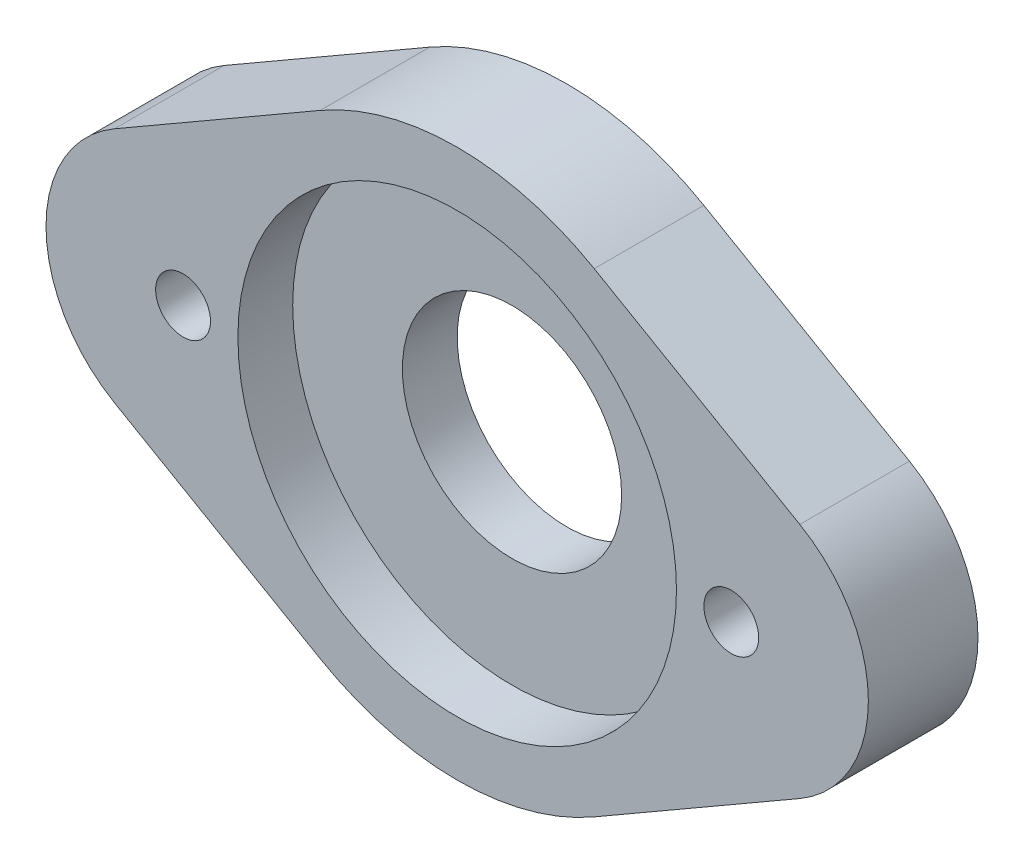
ISO-10303-21;
HEADER;
FILE_DESCRIPTION(('STEP AP214'),'2;1');
FILE_NAME('part.step','',(''),(''),'','','');
FILE_SCHEMA(('AUTOMOTIVE_DESIGN { 1 0 10303 214 1 1 1 1 }'));
ENDSEC;
DATA;
#1=APPLICATION_CONTEXT('core data for automotive mechanical design processes');
#2=APPLICATION_PROTOCOL_DEFINITION('international standard','automotive_design',2000,#1);
#3=PRODUCT_CONTEXT('',#1,'mechanical');
#4=PRODUCT('Part','Part','',(#3));
#5=PRODUCT_RELATED_PRODUCT_CATEGORY('part','',(#4));
#6=PRODUCT_DEFINITION_FORMATION('','',#4);
#7=PRODUCT_DEFINITION_CONTEXT('part definition',#1,'design');
#8=PRODUCT_DEFINITION('design','',#6,#7);
#9=PRODUCT_DEFINITION_SHAPE('','',#8);
#10=(LENGTH_UNIT() NAMED_UNIT(*) SI_UNIT(.MILLI.,.METRE.));
#11=(NAMED_UNIT(*) PLANE_ANGLE_UNIT() SI_UNIT($,.RADIAN.));
#12=(NAMED_UNIT(*) SI_UNIT($,.STERADIAN.) SOLID_ANGLE_UNIT());
#13=UNCERTAINTY_MEASURE_WITH_UNIT(LENGTH_MEASURE(1.E-05),#10,'distance_accuracy_value','');
#14=(GEOMETRIC_REPRESENTATION_CONTEXT(3) GLOBAL_UNCERTAINTY_ASSIGNED_CONTEXT((#13)) GLOBAL_UNIT_ASSIGNED_CONTEXT((#10,
#11,#12)) REPRESENTATION_CONTEXT('',''));
#15=CARTESIAN_POINT('',(0.,0.,0.));
#16=DIRECTION('',(0.,0.,1.));
#17=DIRECTION('',(1.,0.,0.));
#18=AXIS2_PLACEMENT_3D('',#15,#16,#17);
#19=CARTESIAN_POINT('',(0.,0.,10.));
#20=DIRECTION('',(0.,0.,-1.));
#21=DIRECTION('',(-1.,0.,0.));
#22=AXIS2_PLACEMENT_3D('',#19,#20,#21);
#23=CYLINDRICAL_SURFACE('',#22,25.);
#24=CARTESIAN_POINT('',(0.,0.,0.));
#25=DIRECTION('',(0.,0.,1.));
#26=DIRECTION('',(1.,0.,0.));
#27=AXIS2_PLACEMENT_3D('',#24,#25,#26);
#28=CIRCLE('',#27,25.);
#29=CARTESIAN_POINT('',(12.5,21.650635094611,0.));
#30=VERTEX_POINT('',#29);
#31=CARTESIAN_POINT('',(-12.5,21.650635094611,0.));
#32=VERTEX_POINT('',#31);
#33=EDGE_CURVE('E145',#30,#32,#28,.T.);
#34=ORIENTED_EDGE('',*,*,#33,.T.);
#35=DIRECTION('',(0.,0.,-1.));
#36=VECTOR('',#35,1.);
#37=CARTESIAN_POINT('',(-12.5,21.650635094611,10.));
#38=LINE('',#37,#36);
#39=CARTESIAN_POINT('',(-12.5,21.650635094611,10.));
#40=VERTEX_POINT('',#39);
#41=EDGE_CURVE('E11',#40,#32,#38,.T.);
#42=ORIENTED_EDGE('',*,*,#41,.F.);
#43=CARTESIAN_POINT('',(0.,0.,10.));
#44=DIRECTION('',(0.,0.,1.));
#45=DIRECTION('',(1.,0.,0.));
#46=AXIS2_PLACEMENT_3D('',#43,#44,#45);
#47=CIRCLE('',#46,25.);
#48=CARTESIAN_POINT('',(12.5,21.650635094611,10.));
#49=VERTEX_POINT('',#48);
#50=EDGE_CURVE('E168',#49,#40,#47,.T.);
#51=ORIENTED_EDGE('',*,*,#50,.F.);
#52=DIRECTION('',(0.,0.,-1.));
#53=VECTOR('',#52,1.);
#54=CARTESIAN_POINT('',(12.5,21.650635094611,10.));
#55=LINE('',#54,#53);
#56=EDGE_CURVE('E141',#49,#30,#55,.T.);
#57=ORIENTED_EDGE('',*,*,#56,.T.);
#58=EDGE_LOOP('',(#34,#42,#51,#57));
#59=FACE_BOUND('',#58,.T.);
#60=ADVANCED_FACE('F44',(#59),#23,.T.);
#61=CARTESIAN_POINT('',(-12.5,21.650635094611,10.));
#62=DIRECTION('',(0.5,-0.866025403784439,0.));
#63=DIRECTION('',(0.866025403784439,0.5,0.));
#64=AXIS2_PLACEMENT_3D('',#61,#62,#63);
#65=PLANE('',#64);
#66=DIRECTION('',(-0.866025403784439,-0.5,0.));
#67=VECTOR('',#66,1.);
#68=CARTESIAN_POINT('',(-12.5,21.650635094611,0.));
#69=LINE('',#68,#67);
#70=CARTESIAN_POINT('',(-31.25,10.8253175473055,0.));
#71=VERTEX_POINT('',#70);
#72=EDGE_CURVE('E149',#32,#71,#69,.T.);
#73=ORIENTED_EDGE('',*,*,#72,.T.);
#74=DIRECTION('',(0.,0.,-1.));
#75=VECTOR('',#74,1.);
#76=CARTESIAN_POINT('',(-31.25,10.8253175473055,10.));
#77=LINE('',#76,#75);
#78=CARTESIAN_POINT('',(-31.25,10.8253175473055,10.));
#79=VERTEX_POINT('',#78);
#80=EDGE_CURVE('E53',#79,#71,#77,.T.);
#81=ORIENTED_EDGE('',*,*,#80,.F.);
#82=DIRECTION('',(-0.866025403784439,-0.5,0.));
#83=VECTOR('',#82,1.);
#84=CARTESIAN_POINT('',(-12.5,21.650635094611,10.));
#85=LINE('',#84,#83);
#86=EDGE_CURVE('E104',#40,#79,#85,.T.);
#87=ORIENTED_EDGE('',*,*,#86,.F.);
#88=ORIENTED_EDGE('',*,*,#41,.T.);
#89=EDGE_LOOP('',(#73,#81,#87,#88));
#90=FACE_BOUND('',#89,.T.);
#91=ADVANCED_FACE('F275',(#90),#65,.F.);
#92=CARTESIAN_POINT('',(-25.,0.,10.));
#93=DIRECTION('',(0.,0.,-1.));
#94=DIRECTION('',(-1.,0.,0.));
#95=AXIS2_PLACEMENT_3D('',#92,#93,#94);
#96=CYLINDRICAL_SURFACE('',#95,12.5);
#97=CARTESIAN_POINT('',(-25.,0.,0.));
#98=DIRECTION('',(0.,0.,1.));
#99=DIRECTION('',(-1.,0.,0.));
#100=AXIS2_PLACEMENT_3D('',#97,#98,#99);
#101=CIRCLE('',#100,12.5);
#102=CARTESIAN_POINT('',(-31.25,-10.8253175473055,0.));
#103=VERTEX_POINT('',#102);
#104=EDGE_CURVE('E153',#71,#103,#101,.T.);
#105=ORIENTED_EDGE('',*,*,#104,.T.);
#106=DIRECTION('',(0.,0.,-1.));
#107=VECTOR('',#106,1.);
#108=CARTESIAN_POINT('',(-31.25,-10.8253175473055,10.));
#109=LINE('',#108,#107);
#110=CARTESIAN_POINT('',(-31.25,-10.8253175473055,10.));
#111=VERTEX_POINT('',#110);
#112=EDGE_CURVE('E179',#111,#103,#109,.T.);
#113=ORIENTED_EDGE('',*,*,#112,.F.);
#114=CARTESIAN_POINT('',(-25.,0.,10.));
#115=DIRECTION('',(0.,0.,1.));
#116=DIRECTION('',(-1.,0.,0.));
#117=AXIS2_PLACEMENT_3D('',#114,#115,#116);
#118=CIRCLE('',#117,12.5);
#119=EDGE_CURVE('E189',#79,#111,#118,.T.);
#120=ORIENTED_EDGE('',*,*,#119,.F.);
#121=ORIENTED_EDGE('',*,*,#80,.T.);
#122=EDGE_LOOP('',(#105,#113,#120,#121));
#123=FACE_BOUND('',#122,.T.);
#124=ADVANCED_FACE('F187',(#123),#96,.T.);
#125=CARTESIAN_POINT('',(-12.5,-21.650635094611,10.));
#126=DIRECTION('',(0.5,0.866025403784439,0.));
#127=DIRECTION('',(-0.866025403784439,0.5,0.));
#128=AXIS2_PLACEMENT_3D('',#125,#126,#127);
#129=PLANE('',#128);
#130=DIRECTION('',(0.866025403784439,-0.5,0.));
#131=VECTOR('',#130,1.);
#132=CARTESIAN_POINT('',(-12.5,-21.650635094611,0.));
#133=LINE('',#132,#131);
#134=CARTESIAN_POINT('',(-12.5,-21.650635094611,0.));
#135=VERTEX_POINT('',#134);
#136=EDGE_CURVE('E156',#103,#135,#133,.T.);
#137=ORIENTED_EDGE('',*,*,#136,.T.);
#138=DIRECTION('',(0.,0.,-1.));
#139=VECTOR('',#138,1.);
#140=CARTESIAN_POINT('',(-12.5,-21.650635094611,10.));
#141=LINE('',#140,#139);
#142=CARTESIAN_POINT('',(-12.5,-21.650635094611,10.));
#143=VERTEX_POINT('',#142);
#144=EDGE_CURVE('E175',#143,#135,#141,.T.);
#145=ORIENTED_EDGE('',*,*,#144,.F.);
#146=DIRECTION('',(0.866025403784439,-0.5,0.));
#147=VECTOR('',#146,1.);
#148=CARTESIAN_POINT('',(-12.5,-21.650635094611,10.));
#149=LINE('',#148,#147);
#150=EDGE_CURVE('E202',#111,#143,#149,.T.);
#151=ORIENTED_EDGE('',*,*,#150,.F.);
#152=ORIENTED_EDGE('',*,*,#112,.T.);
#153=EDGE_LOOP('',(#137,#145,#151,#152));
#154=FACE_BOUND('',#153,.T.);
#155=ADVANCED_FACE('F197',(#154),#129,.F.);
#156=CARTESIAN_POINT('',(0.,0.,10.));
#157=DIRECTION('',(0.,0.,-1.));
#158=DIRECTION('',(-1.,0.,0.));
#159=AXIS2_PLACEMENT_3D('',#156,#157,#158);
#160=CYLINDRICAL_SURFACE('',#159,25.);
#161=CARTESIAN_POINT('',(0.,0.,0.));
#162=DIRECTION('',(0.,0.,1.));
#163=DIRECTION('',(1.,0.,0.));
#164=AXIS2_PLACEMENT_3D('',#161,#162,#163);
#165=CIRCLE('',#164,25.);
#166=CARTESIAN_POINT('',(12.5,-21.650635094611,0.));
#167=VERTEX_POINT('',#166);
#168=EDGE_CURVE('E159',#135,#167,#165,.T.);
#169=ORIENTED_EDGE('',*,*,#168,.T.);
#170=DIRECTION('',(0.,0.,-1.));
#171=VECTOR('',#170,1.);
#172=CARTESIAN_POINT('',(12.5,-21.650635094611,10.));
#173=LINE('',#172,#171);
#174=CARTESIAN_POINT('',(12.5,-21.650635094611,10.));
#175=VERTEX_POINT('',#174);
#176=EDGE_CURVE('E134',#175,#167,#173,.T.);
#177=ORIENTED_EDGE('',*,*,#176,.F.);
#178=CARTESIAN_POINT('',(0.,0.,10.));
#179=DIRECTION('',(0.,0.,1.));
#180=DIRECTION('',(1.,0.,0.));
#181=AXIS2_PLACEMENT_3D('',#178,#179,#180);
#182=CIRCLE('',#181,25.);
#183=EDGE_CURVE('E123',#143,#175,#182,.T.);
#184=ORIENTED_EDGE('',*,*,#183,.F.);
#185=ORIENTED_EDGE('',*,*,#144,.T.);
#186=EDGE_LOOP('',(#169,#177,#184,#185));
#187=FACE_BOUND('',#186,.T.);
#188=ADVANCED_FACE('F200',(#187),#160,.T.);
#189=CARTESIAN_POINT('',(12.5,-21.650635094611,10.));
#190=DIRECTION('',(-0.5,0.866025403784439,0.));
#191=DIRECTION('',(-0.866025403784439,-0.5,0.));
#192=AXIS2_PLACEMENT_3D('',#189,#190,#191);
#193=PLANE('',#192);
#194=DIRECTION('',(0.866025403784439,0.5,0.));
#195=VECTOR('',#194,1.);
#196=CARTESIAN_POINT('',(12.5,-21.650635094611,0.));
#197=LINE('',#196,#195);
#198=CARTESIAN_POINT('',(31.25,-10.8253175473055,0.));
#199=VERTEX_POINT('',#198);
#200=EDGE_CURVE('E132',#167,#199,#197,.T.);
#201=ORIENTED_EDGE('',*,*,#200,.T.);
#202=DIRECTION('',(0.,0.,-1.));
#203=VECTOR('',#202,1.);
#204=CARTESIAN_POINT('',(31.25,-10.8253175473055,10.));
#205=LINE('',#204,#203);
#206=CARTESIAN_POINT('',(31.25,-10.8253175473055,10.));
#207=VERTEX_POINT('',#206);
#208=EDGE_CURVE('E129',#207,#199,#205,.T.);
#209=ORIENTED_EDGE('',*,*,#208,.F.);
#210=DIRECTION('',(0.866025403784439,0.5,0.));
#211=VECTOR('',#210,1.);
#212=CARTESIAN_POINT('',(12.5,-21.650635094611,10.));
#213=LINE('',#212,#211);
#214=EDGE_CURVE('E117',#175,#207,#213,.T.);
#215=ORIENTED_EDGE('',*,*,#214,.F.);
#216=ORIENTED_EDGE('',*,*,#176,.T.);
#217=EDGE_LOOP('',(#201,#209,#215,#216));
#218=FACE_BOUND('',#217,.T.);
#219=ADVANCED_FACE('F130',(#218),#193,.F.);
#220=CARTESIAN_POINT('',(25.,0.,10.));
#221=DIRECTION('',(0.,0.,-1.));
#222=DIRECTION('',(-1.,0.,0.));
#223=AXIS2_PLACEMENT_3D('',#220,#221,#222);
#224=CYLINDRICAL_SURFACE('',#223,12.5);
#225=CARTESIAN_POINT('',(25.,0.,0.));
#226=DIRECTION('',(0.,0.,1.));
#227=DIRECTION('',(1.,0.,0.));
#228=AXIS2_PLACEMENT_3D('',#225,#226,#227);
#229=CIRCLE('',#228,12.5);
#230=CARTESIAN_POINT('',(31.25,10.8253175473055,0.));
#231=VERTEX_POINT('',#230);
#232=EDGE_CURVE('E90',#199,#231,#229,.T.);
#233=ORIENTED_EDGE('',*,*,#232,.T.);
#234=DIRECTION('',(0.,0.,-1.));
#235=VECTOR('',#234,1.);
#236=CARTESIAN_POINT('',(31.25,10.8253175473055,10.));
#237=LINE('',#236,#235);
#238=CARTESIAN_POINT('',(31.25,10.8253175473055,10.));
#239=VERTEX_POINT('',#238);
#240=EDGE_CURVE('E135',#239,#231,#237,.T.);
#241=ORIENTED_EDGE('',*,*,#240,.F.);
#242=CARTESIAN_POINT('',(25.,0.,10.));
#243=DIRECTION('',(0.,0.,1.));
#244=DIRECTION('',(1.,0.,0.));
#245=AXIS2_PLACEMENT_3D('',#242,#243,#244);
#246=CIRCLE('',#245,12.5);
#247=EDGE_CURVE('E121',#207,#239,#246,.T.);
#248=ORIENTED_EDGE('',*,*,#247,.F.);
#249=ORIENTED_EDGE('',*,*,#208,.T.);
#250=EDGE_LOOP('',(#233,#241,#248,#249));
#251=FACE_BOUND('',#250,.T.);
#252=ADVANCED_FACE('F137',(#251),#224,.T.);
#253=CARTESIAN_POINT('',(12.5,21.650635094611,10.));
#254=DIRECTION('',(-0.5,-0.866025403784439,0.));
#255=DIRECTION('',(0.866025403784439,-0.5,0.));
#256=AXIS2_PLACEMENT_3D('',#253,#254,#255);
#257=PLANE('',#256);
#258=DIRECTION('',(-0.866025403784439,0.5,0.));
#259=VECTOR('',#258,1.);
#260=CARTESIAN_POINT('',(12.5,21.650635094611,0.));
#261=LINE('',#260,#259);
#262=EDGE_CURVE('E96',#231,#30,#261,.T.);
#263=ORIENTED_EDGE('',*,*,#262,.T.);
#264=ORIENTED_EDGE('',*,*,#56,.F.);
#265=DIRECTION('',(-0.866025403784439,0.5,0.));
#266=VECTOR('',#265,1.);
#267=CARTESIAN_POINT('',(12.5,21.650635094611,10.));
#268=LINE('',#267,#266);
#269=EDGE_CURVE('E61',#239,#49,#268,.T.);
#270=ORIENTED_EDGE('',*,*,#269,.F.);
#271=ORIENTED_EDGE('',*,*,#240,.T.);
#272=EDGE_LOOP('',(#263,#264,#270,#271));
#273=FACE_BOUND('',#272,.T.);
#274=ADVANCED_FACE('F282',(#273),#257,.F.);
#275=CARTESIAN_POINT('',(0.,0.,10.));
#276=DIRECTION('',(0.,0.,1.));
#277=DIRECTION('',(1.,0.,0.));
#278=AXIS2_PLACEMENT_3D('',#275,#276,#277);
#279=PLANE('',#278);
#280=CARTESIAN_POINT('',(25.,0.,10.));
#281=DIRECTION('',(0.,0.,-1.));
#282=DIRECTION('',(-1.,0.,0.));
#283=AXIS2_PLACEMENT_3D('',#280,#281,#282);
#284=CIRCLE('',#283,2.5);
#285=CARTESIAN_POINT('',(22.5,0.,10.));
#286=VERTEX_POINT('',#285);
#287=EDGE_CURVE('E235',#286,#286,#284,.T.);
#288=ORIENTED_EDGE('',*,*,#287,.T.);
#289=EDGE_LOOP('',(#288));
#290=FACE_BOUND('',#289,.T.);
#291=CARTESIAN_POINT('',(-25.,0.,10.));
#292=DIRECTION('',(0.,0.,1.));
#293=DIRECTION('',(1.,0.,0.));
#294=AXIS2_PLACEMENT_3D('',#291,#292,#293);
#295=CIRCLE('',#294,2.5);
#296=CARTESIAN_POINT('',(-22.5,0.,10.));
#297=VERTEX_POINT('',#296);
#298=EDGE_CURVE('E231',#297,#297,#295,.T.);
#299=ORIENTED_EDGE('',*,*,#298,.F.);
#300=EDGE_LOOP('',(#299));
#301=FACE_BOUND('',#300,.T.);
#302=CARTESIAN_POINT('',(0.,0.,10.));
#303=DIRECTION('',(0.,0.,1.));
#304=DIRECTION('',(1.,0.,0.));
#305=AXIS2_PLACEMENT_3D('',#302,#303,#304);
#306=CIRCLE('',#305,20.);
#307=CARTESIAN_POINT('',(20.,0.,10.));
#308=VERTEX_POINT('',#307);
#309=EDGE_CURVE('E212',#308,#308,#306,.T.);
#310=ORIENTED_EDGE('',*,*,#309,.F.);
#311=EDGE_LOOP('',(#310));
#312=FACE_BOUND('',#311,.T.);
#313=ORIENTED_EDGE('',*,*,#50,.T.);
#314=ORIENTED_EDGE('',*,*,#86,.T.);
#315=ORIENTED_EDGE('',*,*,#119,.T.);
#316=ORIENTED_EDGE('',*,*,#150,.T.);
#317=ORIENTED_EDGE('',*,*,#183,.T.);
#318=ORIENTED_EDGE('',*,*,#214,.T.);
#319=ORIENTED_EDGE('',*,*,#247,.T.);
#320=ORIENTED_EDGE('',*,*,#269,.T.);
#321=EDGE_LOOP('',(#313,#314,#315,#316,#317,#318,#319,#320));
#322=FACE_BOUND('',#321,.T.);
#323=ADVANCED_FACE('F119',(#290,#301,#312,#322),#279,.T.);
#324=CARTESIAN_POINT('',(0.,0.,0.));
#325=DIRECTION('',(0.,0.,1.));
#326=DIRECTION('',(1.,0.,0.));
#327=AXIS2_PLACEMENT_3D('',#324,#325,#326);
#328=PLANE('',#327);
#329=CARTESIAN_POINT('',(25.,0.,0.));
#330=DIRECTION('',(0.,0.,1.));
#331=DIRECTION('',(1.,0.,0.));
#332=AXIS2_PLACEMENT_3D('',#329,#330,#331);
#333=CIRCLE('',#332,2.5);
#334=CARTESIAN_POINT('',(27.5,0.,0.));
#335=VERTEX_POINT('',#334);
#336=EDGE_CURVE('E236',#335,#335,#333,.T.);
#337=ORIENTED_EDGE('',*,*,#336,.T.);
#338=EDGE_LOOP('',(#337));
#339=FACE_BOUND('',#338,.T.);
#340=CARTESIAN_POINT('',(-25.,0.,0.));
#341=DIRECTION('',(0.,0.,1.));
#342=DIRECTION('',(1.,0.,0.));
#343=AXIS2_PLACEMENT_3D('',#340,#341,#342);
#344=CIRCLE('',#343,2.5);
#345=CARTESIAN_POINT('',(-22.5,0.,0.));
#346=VERTEX_POINT('',#345);
#347=EDGE_CURVE('E227',#346,#346,#344,.F.);
#348=ORIENTED_EDGE('',*,*,#347,.F.);
#349=EDGE_LOOP('',(#348));
#350=FACE_BOUND('',#349,.T.);
#351=CARTESIAN_POINT('',(0.,0.,0.));
#352=DIRECTION('',(0.,0.,1.));
#353=DIRECTION('',(1.,0.,0.));
#354=AXIS2_PLACEMENT_3D('',#351,#352,#353);
#355=CIRCLE('',#354,10.);
#356=CARTESIAN_POINT('',(10.,0.,0.));
#357=VERTEX_POINT('',#356);
#358=EDGE_CURVE('E216',#357,#357,#355,.F.);
#359=ORIENTED_EDGE('',*,*,#358,.F.);
#360=EDGE_LOOP('',(#359));
#361=FACE_BOUND('',#360,.T.);
#362=ORIENTED_EDGE('',*,*,#33,.F.);
#363=ORIENTED_EDGE('',*,*,#262,.F.);
#364=ORIENTED_EDGE('',*,*,#232,.F.);
#365=ORIENTED_EDGE('',*,*,#200,.F.);
#366=ORIENTED_EDGE('',*,*,#168,.F.);
#367=ORIENTED_EDGE('',*,*,#136,.F.);
#368=ORIENTED_EDGE('',*,*,#104,.F.);
#369=ORIENTED_EDGE('',*,*,#72,.F.);
#370=EDGE_LOOP('',(#362,#363,#364,#365,#366,#367,#368,#369));
#371=FACE_BOUND('',#370,.T.);
#372=ADVANCED_FACE('F193',(#339,#350,#361,#371),#328,.F.);
#373=CARTESIAN_POINT('',(0.,0.,5.));
#374=DIRECTION('',(0.,0.,1.));
#375=DIRECTION('',(1.,0.,0.));
#376=AXIS2_PLACEMENT_3D('',#373,#374,#375);
#377=CYLINDRICAL_SURFACE('',#376,20.);
#378=CARTESIAN_POINT('',(0.,0.,5.));
#379=DIRECTION('',(0.,0.,1.));
#380=DIRECTION('',(1.,0.,0.));
#381=AXIS2_PLACEMENT_3D('',#378,#379,#380);
#382=CIRCLE('',#381,20.);
#383=CARTESIAN_POINT('',(20.,0.,5.));
#384=VERTEX_POINT('',#383);
#385=EDGE_CURVE('E150',#384,#384,#382,.T.);
#386=ORIENTED_EDGE('',*,*,#385,.F.);
#387=EDGE_LOOP('',(#386));
#388=FACE_BOUND('',#387,.T.);
#389=ORIENTED_EDGE('',*,*,#309,.T.);
#390=EDGE_LOOP('',(#389));
#391=FACE_BOUND('',#390,.T.);
#392=ADVANCED_FACE('F255',(#388,#391),#377,.F.);
#393=CARTESIAN_POINT('',(0.,0.,5.));
#394=DIRECTION('',(0.,0.,1.));
#395=DIRECTION('',(1.,0.,0.));
#396=AXIS2_PLACEMENT_3D('',#393,#394,#395);
#397=PLANE('',#396);
#398=CARTESIAN_POINT('',(0.,0.,5.));
#399=DIRECTION('',(0.,0.,1.));
#400=DIRECTION('',(1.,0.,0.));
#401=AXIS2_PLACEMENT_3D('',#398,#399,#400);
#402=CIRCLE('',#401,10.);
#403=CARTESIAN_POINT('',(10.,0.,5.));
#404=VERTEX_POINT('',#403);
#405=EDGE_CURVE('E223',#404,#404,#402,.T.);
#406=ORIENTED_EDGE('',*,*,#405,.F.);
#407=EDGE_LOOP('',(#406));
#408=FACE_BOUND('',#407,.T.);
#409=ORIENTED_EDGE('',*,*,#385,.T.);
#410=EDGE_LOOP('',(#409));
#411=FACE_BOUND('',#410,.T.);
#412=ADVANCED_FACE('F263',(#408,#411),#397,.T.);
#413=CARTESIAN_POINT('',(0.,0.,-0.00100000000000013));
#414=DIRECTION('',(0.,0.,1.));
#415=DIRECTION('',(1.,0.,0.));
#416=AXIS2_PLACEMENT_3D('',#413,#414,#415);
#417=CYLINDRICAL_SURFACE('',#416,10.);
#418=ORIENTED_EDGE('',*,*,#405,.T.);
#419=EDGE_LOOP('',(#418));
#420=FACE_BOUND('',#419,.T.);
#421=ORIENTED_EDGE('',*,*,#358,.T.);
#422=EDGE_LOOP('',(#421));
#423=FACE_BOUND('',#422,.T.);
#424=ADVANCED_FACE('F261',(#420,#423),#417,.F.);
#425=CARTESIAN_POINT('',(-25.,0.,-0.000999999999999265));
#426=DIRECTION('',(0.,0.,1.));
#427=DIRECTION('',(1.,0.,0.));
#428=AXIS2_PLACEMENT_3D('',#425,#426,#427);
#429=CYLINDRICAL_SURFACE('',#428,2.5);
#430=ORIENTED_EDGE('',*,*,#298,.T.);
#431=EDGE_LOOP('',(#430));
#432=FACE_BOUND('',#431,.T.);
#433=ORIENTED_EDGE('',*,*,#347,.T.);
#434=EDGE_LOOP('',(#433));
#435=FACE_BOUND('',#434,.T.);
#436=ADVANCED_FACE('F249',(#432,#435),#429,.F.);
#437=CARTESIAN_POINT('',(25.,0.,-0.000999999999999265));
#438=DIRECTION('',(0.,0.,1.));
#439=DIRECTION('',(1.,0.,0.));
#440=AXIS2_PLACEMENT_3D('',#437,#438,#439);
#441=CYLINDRICAL_SURFACE('',#440,2.5);
#442=ORIENTED_EDGE('',*,*,#287,.F.);
#443=EDGE_LOOP('',(#442));
#444=FACE_BOUND('',#443,.T.);
#445=ORIENTED_EDGE('',*,*,#336,.F.);
#446=EDGE_LOOP('',(#445));
#447=FACE_BOUND('',#446,.T.);
#448=ADVANCED_FACE('F246',(#444,#447),#441,.F.);
#449=CLOSED_SHELL('',(#60,#91,#124,#155,#188,#219,#252,#274,#323,#372,#392,#412,#424,#436,#448));
#450=MANIFOLD_SOLID_BREP('B2',#449);
#451=ADVANCED_BREP_SHAPE_REPRESENTATION('',(#18,#450),#14);
#452=SHAPE_DEFINITION_REPRESENTATION(#9,#451);
ENDSEC;
END-ISO-10303-21;
